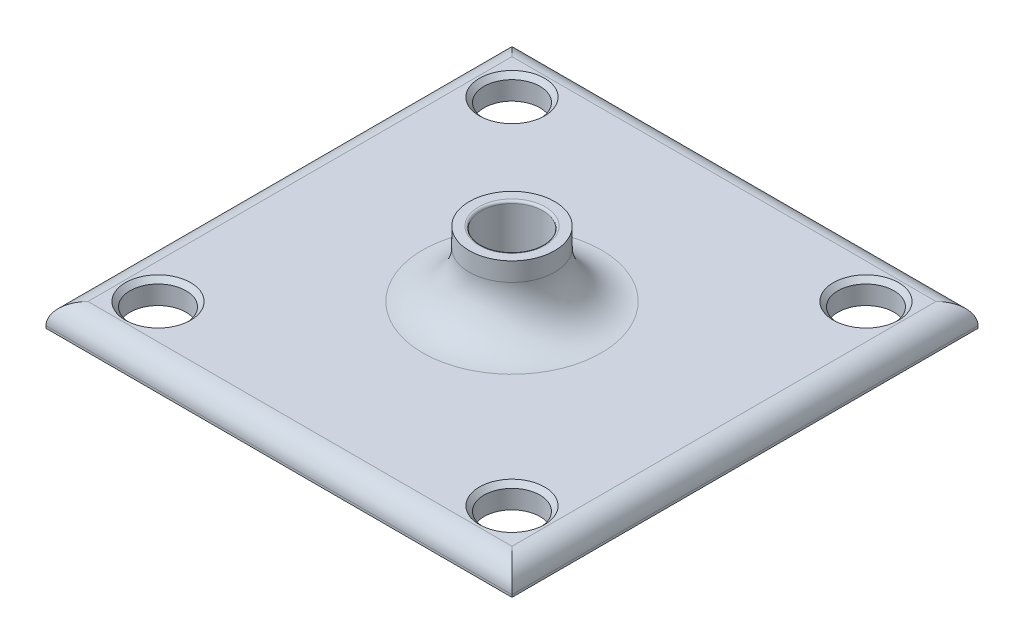
ISO-10303-21;
HEADER;
FILE_DESCRIPTION(('STEP AP214'),'2;1');
FILE_NAME('part.step','',(''),(''),'','','');
FILE_SCHEMA(('AUTOMOTIVE_DESIGN { 1 0 10303 214 1 1 1 1 }'));
ENDSEC;
DATA;
#1=APPLICATION_CONTEXT('core data for automotive mechanical design processes');
#2=APPLICATION_PROTOCOL_DEFINITION('international standard','automotive_design',2000,#1);
#3=PRODUCT_CONTEXT('',#1,'mechanical');
#4=PRODUCT('Part','Part','',(#3));
#5=PRODUCT_RELATED_PRODUCT_CATEGORY('part','',(#4));
#6=PRODUCT_DEFINITION_FORMATION('','',#4);
#7=PRODUCT_DEFINITION_CONTEXT('part definition',#1,'design');
#8=PRODUCT_DEFINITION('design','',#6,#7);
#9=PRODUCT_DEFINITION_SHAPE('','',#8);
#10=(LENGTH_UNIT() NAMED_UNIT(*) SI_UNIT(.MILLI.,.METRE.));
#11=(NAMED_UNIT(*) PLANE_ANGLE_UNIT() SI_UNIT($,.RADIAN.));
#12=(NAMED_UNIT(*) SI_UNIT($,.STERADIAN.) SOLID_ANGLE_UNIT());
#13=UNCERTAINTY_MEASURE_WITH_UNIT(LENGTH_MEASURE(1.E-05),#10,'distance_accuracy_value','');
#14=(GEOMETRIC_REPRESENTATION_CONTEXT(3) GLOBAL_UNCERTAINTY_ASSIGNED_CONTEXT((#13)) GLOBAL_UNIT_ASSIGNED_CONTEXT((#10,
#11,#12)) REPRESENTATION_CONTEXT('',''));
#15=CARTESIAN_POINT('',(0.,0.,0.));
#16=DIRECTION('',(0.,0.,1.));
#17=DIRECTION('',(1.,0.,0.));
#18=AXIS2_PLACEMENT_3D('',#15,#16,#17);
#19=CARTESIAN_POINT('',(0.,2.5,0.));
#20=DIRECTION('',(0.,-1.,0.));
#21=DIRECTION('',(0.,0.,-1.));
#22=AXIS2_PLACEMENT_3D('',#19,#20,#21);
#23=PLANE('',#22);
#24=CARTESIAN_POINT('',(0.,2.5,0.));
#25=DIRECTION('',(0.,1.,0.));
#26=DIRECTION('',(0.,0.,1.));
#27=AXIS2_PLACEMENT_3D('',#24,#25,#26);
#28=CIRCLE('',#27,1.525);
#29=CARTESIAN_POINT('',(0.,2.5,1.525));
#30=VERTEX_POINT('',#29);
#31=EDGE_CURVE('E114',#30,#30,#28,.T.);
#32=ORIENTED_EDGE('',*,*,#31,.F.);
#33=EDGE_LOOP('',(#32));
#34=FACE_BOUND('',#33,.T.);
#35=CARTESIAN_POINT('',(0.,2.5,0.));
#36=DIRECTION('',(0.,1.,0.));
#37=DIRECTION('',(0.,0.,1.));
#38=AXIS2_PLACEMENT_3D('',#35,#36,#37);
#39=CIRCLE('',#38,3.325);
#40=CARTESIAN_POINT('',(0.,2.5,3.325));
#41=VERTEX_POINT('',#40);
#42=EDGE_CURVE('E169',#41,#41,#39,.T.);
#43=ORIENTED_EDGE('',*,*,#42,.T.);
#44=EDGE_LOOP('',(#43));
#45=FACE_BOUND('',#44,.T.);
#46=ADVANCED_FACE('F33',(#34,#45),#23,.F.);
#47=CARTESIAN_POINT('',(-18.9895923599143,2.5,18.9895923599143));
#48=DIRECTION('',(0.,-1.,0.));
#49=DIRECTION('',(0.,0.,-1.));
#50=AXIS2_PLACEMENT_3D('',#47,#48,#49);
#51=CIRCLE('',#50,3.49999999999999);
#52=CARTESIAN_POINT('',(-18.9895923599143,2.5,15.4895923599144));
#53=VERTEX_POINT('',#52);
#54=EDGE_CURVE('E178',#53,#53,#51,.T.);
#55=ORIENTED_EDGE('',*,*,#54,.T.);
#56=EDGE_LOOP('',(#55));
#57=FACE_BOUND('',#56,.T.);
#58=CARTESIAN_POINT('',(18.9895923599143,2.5,18.9895923599143));
#59=DIRECTION('',(0.,-1.,0.));
#60=DIRECTION('',(0.,0.,-1.));
#61=AXIS2_PLACEMENT_3D('',#58,#59,#60);
#62=CIRCLE('',#61,3.50000000000002);
#63=CARTESIAN_POINT('',(18.9895923599143,2.5,15.4895923599143));
#64=VERTEX_POINT('',#63);
#65=EDGE_CURVE('E175',#64,#64,#62,.T.);
#66=ORIENTED_EDGE('',*,*,#65,.T.);
#67=EDGE_LOOP('',(#66));
#68=FACE_BOUND('',#67,.T.);
#69=CARTESIAN_POINT('',(18.9895923599143,2.5,-18.9895923599143));
#70=DIRECTION('',(0.,-1.,0.));
#71=DIRECTION('',(0.,0.,-1.));
#72=AXIS2_PLACEMENT_3D('',#69,#70,#71);
#73=CIRCLE('',#72,3.49999999999999);
#74=CARTESIAN_POINT('',(18.9895923599143,2.5,-22.4895923599143));
#75=VERTEX_POINT('',#74);
#76=EDGE_CURVE('E172',#75,#75,#73,.T.);
#77=ORIENTED_EDGE('',*,*,#76,.T.);
#78=EDGE_LOOP('',(#77));
#79=FACE_BOUND('',#78,.T.);
#80=CARTESIAN_POINT('',(-18.9895923599143,2.5,-18.9895923599143));
#81=DIRECTION('',(0.,-1.,0.));
#82=DIRECTION('',(0.,0.,-1.));
#83=AXIS2_PLACEMENT_3D('',#80,#81,#82);
#84=CIRCLE('',#83,3.50000000000002);
#85=CARTESIAN_POINT('',(-18.9895923599143,2.5,-22.4895923599144));
#86=VERTEX_POINT('',#85);
#87=EDGE_CURVE('E158',#86,#86,#84,.T.);
#88=ORIENTED_EDGE('',*,*,#87,.T.);
#89=EDGE_LOOP('',(#88));
#90=FACE_BOUND('',#89,.T.);
#91=DIRECTION('',(0.,0.,-1.));
#92=VECTOR('',#91,1.);
#93=CARTESIAN_POINT('',(22.75,2.5,0.));
#94=LINE('',#93,#92);
#95=CARTESIAN_POINT('',(22.75,2.5,22.75));
#96=VERTEX_POINT('',#95);
#97=CARTESIAN_POINT('',(22.75,2.5,-22.75));
#98=VERTEX_POINT('',#97);
#99=EDGE_CURVE('E148',#96,#98,#94,.T.);
#100=ORIENTED_EDGE('',*,*,#99,.T.);
#101=DIRECTION('',(-1.,0.,0.));
#102=VECTOR('',#101,1.);
#103=CARTESIAN_POINT('',(0.,2.5,-22.75));
#104=LINE('',#103,#102);
#105=CARTESIAN_POINT('',(-22.75,2.5,-22.75));
#106=VERTEX_POINT('',#105);
#107=EDGE_CURVE('E150',#98,#106,#104,.T.);
#108=ORIENTED_EDGE('',*,*,#107,.T.);
#109=DIRECTION('',(0.,0.,1.));
#110=VECTOR('',#109,1.);
#111=CARTESIAN_POINT('',(-22.75,2.5,0.));
#112=LINE('',#111,#110);
#113=CARTESIAN_POINT('',(-22.75,2.5,22.75));
#114=VERTEX_POINT('',#113);
#115=EDGE_CURVE('E144',#106,#114,#112,.T.);
#116=ORIENTED_EDGE('',*,*,#115,.T.);
#117=DIRECTION('',(1.,0.,0.));
#118=VECTOR('',#117,1.);
#119=CARTESIAN_POINT('',(0.,2.5,22.75));
#120=LINE('',#119,#118);
#121=EDGE_CURVE('E146',#114,#96,#120,.T.);
#122=ORIENTED_EDGE('',*,*,#121,.T.);
#123=EDGE_LOOP('',(#100,#108,#116,#122));
#124=FACE_BOUND('',#123,.T.);
#125=CARTESIAN_POINT('',(0.,2.5,0.));
#126=DIRECTION('',(0.,-1.,0.));
#127=DIRECTION('',(0.,0.,-1.));
#128=AXIS2_PLACEMENT_3D('',#125,#126,#127);
#129=CIRCLE('',#128,9.575);
#130=CARTESIAN_POINT('',(0.,2.5,-9.575));
#131=VERTEX_POINT('',#130);
#132=EDGE_CURVE('E141',#131,#131,#129,.T.);
#133=ORIENTED_EDGE('',*,*,#132,.T.);
#134=EDGE_LOOP('',(#133));
#135=FACE_BOUND('',#134,.T.);
#136=ADVANCED_FACE('F208',(#57,#68,#79,#90,#124,#135),#23,.F.);
#137=CARTESIAN_POINT('',(0.,0.,0.));
#138=DIRECTION('',(0.,-1.,0.));
#139=DIRECTION('',(0.,0.,-1.));
#140=AXIS2_PLACEMENT_3D('',#137,#138,#139);
#141=PLANE('',#140);
#142=CARTESIAN_POINT('',(18.9895923599143,0.,-18.9895923599143));
#143=DIRECTION('',(0.,-1.,0.));
#144=DIRECTION('',(0.,0.,-1.));
#145=AXIS2_PLACEMENT_3D('',#142,#143,#144);
#146=CIRCLE('',#145,3.);
#147=CARTESIAN_POINT('',(18.9895923599143,0.,-21.9895923599143));
#148=VERTEX_POINT('',#147);
#149=EDGE_CURVE('E129',#148,#148,#146,.F.);
#150=ORIENTED_EDGE('',*,*,#149,.T.);
#151=EDGE_LOOP('',(#150));
#152=FACE_BOUND('',#151,.T.);
#153=CARTESIAN_POINT('',(-18.9895923599143,0.,-18.9895923599143));
#154=DIRECTION('',(0.,-1.,0.));
#155=DIRECTION('',(0.,0.,-1.));
#156=AXIS2_PLACEMENT_3D('',#153,#154,#155);
#157=CIRCLE('',#156,3.);
#158=CARTESIAN_POINT('',(-18.9895923599143,0.,-21.9895923599143));
#159=VERTEX_POINT('',#158);
#160=EDGE_CURVE('E126',#159,#159,#157,.T.);
#161=ORIENTED_EDGE('',*,*,#160,.F.);
#162=EDGE_LOOP('',(#161));
#163=FACE_BOUND('',#162,.T.);
#164=CARTESIAN_POINT('',(0.,0.,0.));
#165=DIRECTION('',(0.,-1.,0.));
#166=DIRECTION('',(0.,0.,-1.));
#167=AXIS2_PLACEMENT_3D('',#164,#165,#166);
#168=CIRCLE('',#167,1.525);
#169=CARTESIAN_POINT('',(0.,0.,-1.525));
#170=VERTEX_POINT('',#169);
#171=EDGE_CURVE('E111',#170,#170,#168,.T.);
#172=ORIENTED_EDGE('',*,*,#171,.F.);
#173=EDGE_LOOP('',(#172));
#174=FACE_BOUND('',#173,.T.);
#175=DIRECTION('',(0.,0.,-1.));
#176=VECTOR('',#175,1.);
#177=CARTESIAN_POINT('',(25.,0.,25.));
#178=LINE('',#177,#176);
#179=CARTESIAN_POINT('',(25.,0.,25.));
#180=VERTEX_POINT('',#179);
#181=CARTESIAN_POINT('',(25.,0.,-25.));
#182=VERTEX_POINT('',#181);
#183=EDGE_CURVE('E104',#180,#182,#178,.T.);
#184=ORIENTED_EDGE('',*,*,#183,.F.);
#185=DIRECTION('',(1.,0.,0.));
#186=VECTOR('',#185,1.);
#187=CARTESIAN_POINT('',(-25.,0.,25.));
#188=LINE('',#187,#186);
#189=CARTESIAN_POINT('',(-25.,0.,25.));
#190=VERTEX_POINT('',#189);
#191=EDGE_CURVE('E120',#190,#180,#188,.T.);
#192=ORIENTED_EDGE('',*,*,#191,.F.);
#193=DIRECTION('',(0.,0.,1.));
#194=VECTOR('',#193,1.);
#195=CARTESIAN_POINT('',(-25.,0.,25.));
#196=LINE('',#195,#194);
#197=CARTESIAN_POINT('',(-25.,0.,-25.));
#198=VERTEX_POINT('',#197);
#199=EDGE_CURVE('E106',#198,#190,#196,.T.);
#200=ORIENTED_EDGE('',*,*,#199,.F.);
#201=DIRECTION('',(-1.,0.,0.));
#202=VECTOR('',#201,1.);
#203=CARTESIAN_POINT('',(-25.,0.,-25.));
#204=LINE('',#203,#202);
#205=EDGE_CURVE('E91',#182,#198,#204,.T.);
#206=ORIENTED_EDGE('',*,*,#205,.F.);
#207=EDGE_LOOP('',(#184,#192,#200,#206));
#208=FACE_BOUND('',#207,.T.);
#209=CARTESIAN_POINT('',(18.9895923599143,0.,18.9895923599143));
#210=DIRECTION('',(0.,-1.,0.));
#211=DIRECTION('',(0.,0.,-1.));
#212=AXIS2_PLACEMENT_3D('',#209,#210,#211);
#213=CIRCLE('',#212,3.);
#214=CARTESIAN_POINT('',(18.9895923599143,0.,15.9895923599144));
#215=VERTEX_POINT('',#214);
#216=EDGE_CURVE('E133',#215,#215,#213,.T.);
#217=ORIENTED_EDGE('',*,*,#216,.F.);
#218=EDGE_LOOP('',(#217));
#219=FACE_BOUND('',#218,.T.);
#220=CARTESIAN_POINT('',(-18.9895923599143,0.,18.9895923599143));
#221=DIRECTION('',(0.,-1.,0.));
#222=DIRECTION('',(0.,0.,-1.));
#223=AXIS2_PLACEMENT_3D('',#220,#221,#222);
#224=CIRCLE('',#223,3.);
#225=CARTESIAN_POINT('',(-18.9895923599143,0.,15.9895923599144));
#226=VERTEX_POINT('',#225);
#227=EDGE_CURVE('E136',#226,#226,#224,.F.);
#228=ORIENTED_EDGE('',*,*,#227,.T.);
#229=EDGE_LOOP('',(#228));
#230=FACE_BOUND('',#229,.T.);
#231=ADVANCED_FACE('F101',(#152,#163,#174,#208,#219,#230),#141,.T.);
#232=CARTESIAN_POINT('',(25.,2.5,25.));
#233=DIRECTION('',(-1.,0.,0.));
#234=DIRECTION('',(0.,0.,1.));
#235=AXIS2_PLACEMENT_3D('',#232,#233,#234);
#236=PLANE('',#235);
#237=DIRECTION('',(0.,-1.,0.));
#238=VECTOR('',#237,1.);
#239=CARTESIAN_POINT('',(25.,2.5,-25.));
#240=LINE('',#239,#238);
#241=CARTESIAN_POINT('',(25.,0.25,-25.));
#242=VERTEX_POINT('',#241);
#243=EDGE_CURVE('E87',#242,#182,#240,.T.);
#244=ORIENTED_EDGE('',*,*,#243,.F.);
#245=DIRECTION('',(0.,0.,-1.));
#246=VECTOR('',#245,1.);
#247=CARTESIAN_POINT('',(25.,0.25,25.));
#248=LINE('',#247,#246);
#249=CARTESIAN_POINT('',(25.,0.25,25.));
#250=VERTEX_POINT('',#249);
#251=EDGE_CURVE('E56',#242,#250,#248,.F.);
#252=ORIENTED_EDGE('',*,*,#251,.T.);
#253=DIRECTION('',(0.,-1.,0.));
#254=VECTOR('',#253,1.);
#255=CARTESIAN_POINT('',(25.,2.5,25.));
#256=LINE('',#255,#254);
#257=EDGE_CURVE('E109',#250,#180,#256,.T.);
#258=ORIENTED_EDGE('',*,*,#257,.T.);
#259=ORIENTED_EDGE('',*,*,#183,.T.);
#260=EDGE_LOOP('',(#244,#252,#258,#259));
#261=FACE_BOUND('',#260,.T.);
#262=ADVANCED_FACE('F108',(#261),#236,.F.);
#263=CARTESIAN_POINT('',(-25.,2.5,-25.));
#264=DIRECTION('',(0.,0.,1.));
#265=DIRECTION('',(1.,0.,0.));
#266=AXIS2_PLACEMENT_3D('',#263,#264,#265);
#267=PLANE('',#266);
#268=DIRECTION('',(0.,-1.,0.));
#269=VECTOR('',#268,1.);
#270=CARTESIAN_POINT('',(-25.,2.5,-25.));
#271=LINE('',#270,#269);
#272=CARTESIAN_POINT('',(-25.,0.25,-25.));
#273=VERTEX_POINT('',#272);
#274=EDGE_CURVE('E97',#273,#198,#271,.T.);
#275=ORIENTED_EDGE('',*,*,#274,.F.);
#276=DIRECTION('',(-1.,0.,0.));
#277=VECTOR('',#276,1.);
#278=CARTESIAN_POINT('',(-25.,0.25,-25.));
#279=LINE('',#278,#277);
#280=EDGE_CURVE('E94',#273,#242,#279,.F.);
#281=ORIENTED_EDGE('',*,*,#280,.T.);
#282=ORIENTED_EDGE('',*,*,#243,.T.);
#283=ORIENTED_EDGE('',*,*,#205,.T.);
#284=EDGE_LOOP('',(#275,#281,#282,#283));
#285=FACE_BOUND('',#284,.T.);
#286=ADVANCED_FACE('F90',(#285),#267,.F.);
#287=CARTESIAN_POINT('',(-25.,2.5,25.));
#288=DIRECTION('',(1.,0.,0.));
#289=DIRECTION('',(0.,0.,-1.));
#290=AXIS2_PLACEMENT_3D('',#287,#288,#289);
#291=PLANE('',#290);
#292=DIRECTION('',(0.,-1.,0.));
#293=VECTOR('',#292,1.);
#294=CARTESIAN_POINT('',(-25.,2.5,25.));
#295=LINE('',#294,#293);
#296=CARTESIAN_POINT('',(-25.,0.25,25.));
#297=VERTEX_POINT('',#296);
#298=EDGE_CURVE('E123',#297,#190,#295,.T.);
#299=ORIENTED_EDGE('',*,*,#298,.F.);
#300=DIRECTION('',(0.,0.,1.));
#301=VECTOR('',#300,1.);
#302=CARTESIAN_POINT('',(-25.,0.25,25.));
#303=LINE('',#302,#301);
#304=EDGE_CURVE('E156',#297,#273,#303,.F.);
#305=ORIENTED_EDGE('',*,*,#304,.T.);
#306=ORIENTED_EDGE('',*,*,#274,.T.);
#307=ORIENTED_EDGE('',*,*,#199,.T.);
#308=EDGE_LOOP('',(#299,#305,#306,#307));
#309=FACE_BOUND('',#308,.T.);
#310=ADVANCED_FACE('F227',(#309),#291,.F.);
#311=CARTESIAN_POINT('',(-25.,2.5,25.));
#312=DIRECTION('',(0.,0.,-1.));
#313=DIRECTION('',(-1.,0.,0.));
#314=AXIS2_PLACEMENT_3D('',#311,#312,#313);
#315=PLANE('',#314);
#316=ORIENTED_EDGE('',*,*,#257,.F.);
#317=DIRECTION('',(1.,0.,0.));
#318=VECTOR('',#317,1.);
#319=CARTESIAN_POINT('',(-25.,0.25,25.));
#320=LINE('',#319,#318);
#321=EDGE_CURVE('E48',#250,#297,#320,.F.);
#322=ORIENTED_EDGE('',*,*,#321,.T.);
#323=ORIENTED_EDGE('',*,*,#298,.T.);
#324=ORIENTED_EDGE('',*,*,#191,.T.);
#325=EDGE_LOOP('',(#316,#322,#323,#324));
#326=FACE_BOUND('',#325,.T.);
#327=ADVANCED_FACE('F224',(#326),#315,.F.);
#328=CARTESIAN_POINT('',(0.,-95.,0.));
#329=DIRECTION('',(0.,1.,0.));
#330=DIRECTION('',(0.,0.,1.));
#331=AXIS2_PLACEMENT_3D('',#328,#329,#330);
#332=CYLINDRICAL_SURFACE('',#331,1.525);
#333=ORIENTED_EDGE('',*,*,#171,.T.);
#334=EDGE_LOOP('',(#333));
#335=FACE_BOUND('',#334,.T.);
#336=ORIENTED_EDGE('',*,*,#31,.T.);
#337=EDGE_LOOP('',(#336));
#338=FACE_BOUND('',#337,.T.);
#339=ADVANCED_FACE('F219',(#335,#338),#332,.F.);
#340=CARTESIAN_POINT('',(-18.9895923599143,-95.,-18.9895923599143));
#341=DIRECTION('',(0.,1.,0.));
#342=DIRECTION('',(0.,0.,1.));
#343=AXIS2_PLACEMENT_3D('',#340,#341,#342);
#344=CYLINDRICAL_SURFACE('',#343,3.);
#345=CARTESIAN_POINT('',(-18.9895923599143,1.99999999999997,-18.9895923599143));
#346=DIRECTION('',(0.,-1.,0.));
#347=DIRECTION('',(0.,0.,-1.));
#348=AXIS2_PLACEMENT_3D('',#345,#346,#347);
#349=CIRCLE('',#348,3.);
#350=CARTESIAN_POINT('',(-18.9895923599143,1.99999999999997,-21.9895923599143));
#351=VERTEX_POINT('',#350);
#352=EDGE_CURVE('E190',#351,#351,#349,.F.);
#353=ORIENTED_EDGE('',*,*,#352,.T.);
#354=EDGE_LOOP('',(#353));
#355=FACE_BOUND('',#354,.T.);
#356=ORIENTED_EDGE('',*,*,#160,.T.);
#357=EDGE_LOOP('',(#356));
#358=FACE_BOUND('',#357,.T.);
#359=ADVANCED_FACE('F305',(#355,#358),#344,.F.);
#360=CARTESIAN_POINT('',(18.9895923599143,-95.,-18.9895923599143));
#361=DIRECTION('',(0.,1.,0.));
#362=DIRECTION('',(0.,0.,1.));
#363=AXIS2_PLACEMENT_3D('',#360,#361,#362);
#364=CYLINDRICAL_SURFACE('',#363,3.);
#365=CARTESIAN_POINT('',(18.9895923599143,2.,-18.9895923599143));
#366=DIRECTION('',(0.,-1.,0.));
#367=DIRECTION('',(0.,0.,-1.));
#368=AXIS2_PLACEMENT_3D('',#365,#366,#367);
#369=CIRCLE('',#368,3.);
#370=CARTESIAN_POINT('',(18.9895923599143,2.,-21.9895923599143));
#371=VERTEX_POINT('',#370);
#372=EDGE_CURVE('E187',#371,#371,#369,.F.);
#373=ORIENTED_EDGE('',*,*,#372,.T.);
#374=EDGE_LOOP('',(#373));
#375=FACE_BOUND('',#374,.T.);
#376=ORIENTED_EDGE('',*,*,#149,.F.);
#377=EDGE_LOOP('',(#376));
#378=FACE_BOUND('',#377,.T.);
#379=ADVANCED_FACE('F301',(#375,#378),#364,.F.);
#380=CARTESIAN_POINT('',(18.9895923599143,-95.,18.9895923599143));
#381=DIRECTION('',(0.,1.,0.));
#382=DIRECTION('',(0.,0.,1.));
#383=AXIS2_PLACEMENT_3D('',#380,#381,#382);
#384=CYLINDRICAL_SURFACE('',#383,3.);
#385=CARTESIAN_POINT('',(18.9895923599143,1.99999999999997,18.9895923599143));
#386=DIRECTION('',(0.,-1.,0.));
#387=DIRECTION('',(0.,0.,-1.));
#388=AXIS2_PLACEMENT_3D('',#385,#386,#387);
#389=CIRCLE('',#388,3.);
#390=CARTESIAN_POINT('',(18.9895923599143,1.99999999999997,15.9895923599144));
#391=VERTEX_POINT('',#390);
#392=EDGE_CURVE('E184',#391,#391,#389,.F.);
#393=ORIENTED_EDGE('',*,*,#392,.T.);
#394=EDGE_LOOP('',(#393));
#395=FACE_BOUND('',#394,.T.);
#396=ORIENTED_EDGE('',*,*,#216,.T.);
#397=EDGE_LOOP('',(#396));
#398=FACE_BOUND('',#397,.T.);
#399=ADVANCED_FACE('F304',(#395,#398),#384,.F.);
#400=CARTESIAN_POINT('',(-18.9895923599143,-95.,18.9895923599143));
#401=DIRECTION('',(0.,1.,0.));
#402=DIRECTION('',(0.,0.,1.));
#403=AXIS2_PLACEMENT_3D('',#400,#401,#402);
#404=CYLINDRICAL_SURFACE('',#403,3.);
#405=CARTESIAN_POINT('',(-18.9895923599143,2.,18.9895923599143));
#406=DIRECTION('',(0.,-1.,0.));
#407=DIRECTION('',(0.,0.,-1.));
#408=AXIS2_PLACEMENT_3D('',#405,#406,#407);
#409=CIRCLE('',#408,3.);
#410=CARTESIAN_POINT('',(-18.9895923599143,2.,15.9895923599144));
#411=VERTEX_POINT('',#410);
#412=EDGE_CURVE('E181',#411,#411,#409,.F.);
#413=ORIENTED_EDGE('',*,*,#412,.T.);
#414=EDGE_LOOP('',(#413));
#415=FACE_BOUND('',#414,.T.);
#416=ORIENTED_EDGE('',*,*,#227,.F.);
#417=EDGE_LOOP('',(#416));
#418=FACE_BOUND('',#417,.T.);
#419=ADVANCED_FACE('F298',(#415,#418),#404,.F.);
#420=CARTESIAN_POINT('',(0.,9.5,0.));
#421=DIRECTION('',(0.,1.,0.));
#422=DIRECTION('',(0.,0.,1.));
#423=AXIS2_PLACEMENT_3D('',#420,#421,#422);
#424=PLANE('',#423);
#425=CARTESIAN_POINT('',(0.,9.5,0.));
#426=DIRECTION('',(0.,1.,0.));
#427=DIRECTION('',(0.,0.,1.));
#428=AXIS2_PLACEMENT_3D('',#425,#426,#427);
#429=CIRCLE('',#428,3.575);
#430=CARTESIAN_POINT('',(0.,9.5,3.575));
#431=VERTEX_POINT('',#430);
#432=EDGE_CURVE('E11',#431,#431,#429,.F.);
#433=ORIENTED_EDGE('',*,*,#432,.T.);
#434=EDGE_LOOP('',(#433));
#435=FACE_BOUND('',#434,.T.);
#436=CARTESIAN_POINT('',(0.,9.5,0.));
#437=DIRECTION('',(0.,1.,0.));
#438=DIRECTION('',(0.,0.,1.));
#439=AXIS2_PLACEMENT_3D('',#436,#437,#438);
#440=CIRCLE('',#439,4.575);
#441=CARTESIAN_POINT('',(0.,9.5,4.575));
#442=VERTEX_POINT('',#441);
#443=EDGE_CURVE('E130',#442,#442,#440,.T.);
#444=ORIENTED_EDGE('',*,*,#443,.T.);
#445=EDGE_LOOP('',(#444));
#446=FACE_BOUND('',#445,.T.);
#447=ADVANCED_FACE('F284',(#435,#446),#424,.T.);
#448=CARTESIAN_POINT('',(0.,9.5,0.));
#449=DIRECTION('',(0.,-1.,0.));
#450=DIRECTION('',(0.,0.,-1.));
#451=AXIS2_PLACEMENT_3D('',#448,#449,#450);
#452=CYLINDRICAL_SURFACE('',#451,4.575);
#453=CARTESIAN_POINT('',(0.,7.5,0.));
#454=DIRECTION('',(0.,-1.,0.));
#455=DIRECTION('',(0.,0.,-1.));
#456=AXIS2_PLACEMENT_3D('',#453,#454,#455);
#457=CIRCLE('',#456,4.575);
#458=CARTESIAN_POINT('',(0.,7.5,-4.575));
#459=VERTEX_POINT('',#458);
#460=EDGE_CURVE('E96',#459,#459,#457,.F.);
#461=ORIENTED_EDGE('',*,*,#460,.T.);
#462=EDGE_LOOP('',(#461));
#463=FACE_BOUND('',#462,.T.);
#464=ORIENTED_EDGE('',*,*,#443,.F.);
#465=EDGE_LOOP('',(#464));
#466=FACE_BOUND('',#465,.T.);
#467=ADVANCED_FACE('F281',(#463,#466),#452,.T.);
#468=CARTESIAN_POINT('',(0.,9.5,0.));
#469=DIRECTION('',(0.,-1.,0.));
#470=DIRECTION('',(0.,0.,-1.));
#471=AXIS2_PLACEMENT_3D('',#468,#469,#470);
#472=CYLINDRICAL_SURFACE('',#471,3.325);
#473=CARTESIAN_POINT('',(0.,9.25,0.));
#474=DIRECTION('',(0.,1.,0.));
#475=DIRECTION('',(0.,0.,1.));
#476=AXIS2_PLACEMENT_3D('',#473,#474,#475);
#477=CIRCLE('',#476,3.325);
#478=CARTESIAN_POINT('',(0.,9.25,3.325));
#479=VERTEX_POINT('',#478);
#480=EDGE_CURVE('E41',#479,#479,#477,.T.);
#481=ORIENTED_EDGE('',*,*,#480,.T.);
#482=EDGE_LOOP('',(#481));
#483=FACE_BOUND('',#482,.T.);
#484=ORIENTED_EDGE('',*,*,#42,.F.);
#485=EDGE_LOOP('',(#484));
#486=FACE_BOUND('',#485,.T.);
#487=ADVANCED_FACE('F195',(#483,#486),#472,.F.);
#488=CARTESIAN_POINT('',(0.,7.5,0.));
#489=DIRECTION('',(0.,-1.,0.));
#490=DIRECTION('',(0.,0.,-1.));
#491=AXIS2_PLACEMENT_3D('',#488,#489,#490);
#492=TOROIDAL_SURFACE('',#491,9.575,5.);
#493=ORIENTED_EDGE('',*,*,#132,.F.);
#494=EDGE_LOOP('',(#493));
#495=FACE_BOUND('',#494,.T.);
#496=ORIENTED_EDGE('',*,*,#460,.F.);
#497=EDGE_LOOP('',(#496));
#498=FACE_BOUND('',#497,.T.);
#499=ADVANCED_FACE('F235',(#495,#498),#492,.F.);
#500=CARTESIAN_POINT('',(0.,0.25,22.75));
#501=DIRECTION('',(1.,0.,0.));
#502=DIRECTION('',(0.,0.,-1.));
#503=AXIS2_PLACEMENT_3D('',#500,#501,#502);
#504=CYLINDRICAL_SURFACE('',#503,2.25);
#505=CARTESIAN_POINT('',(-22.75,0.25,22.75));
#506=DIRECTION('',(0.707106781186547,0.,0.707106781186547));
#507=DIRECTION('',(-0.707106781186547,0.,0.707106781186547));
#508=AXIS2_PLACEMENT_3D('',#505,#506,#507);
#509=ELLIPSE('',#508,3.18198051533946,2.25);
#510=EDGE_CURVE('E163',#297,#114,#509,.F.);
#511=ORIENTED_EDGE('',*,*,#510,.F.);
#512=ORIENTED_EDGE('',*,*,#321,.F.);
#513=CARTESIAN_POINT('',(22.75,0.25,22.75));
#514=DIRECTION('',(0.707106781186547,0.,-0.707106781186547));
#515=DIRECTION('',(0.707106781186547,0.,0.707106781186547));
#516=AXIS2_PLACEMENT_3D('',#513,#514,#515);
#517=ELLIPSE('',#516,3.18198051533946,2.25);
#518=EDGE_CURVE('E166',#96,#250,#517,.T.);
#519=ORIENTED_EDGE('',*,*,#518,.F.);
#520=ORIENTED_EDGE('',*,*,#121,.F.);
#521=EDGE_LOOP('',(#511,#512,#519,#520));
#522=FACE_BOUND('',#521,.T.);
#523=ADVANCED_FACE('F238',(#522),#504,.T.);
#524=CARTESIAN_POINT('',(22.75,0.25,0.));
#525=DIRECTION('',(0.,0.,-1.));
#526=DIRECTION('',(-1.,0.,0.));
#527=AXIS2_PLACEMENT_3D('',#524,#525,#526);
#528=CYLINDRICAL_SURFACE('',#527,2.25);
#529=ORIENTED_EDGE('',*,*,#518,.T.);
#530=ORIENTED_EDGE('',*,*,#251,.F.);
#531=CARTESIAN_POINT('',(22.75,0.25,-22.75));
#532=DIRECTION('',(-0.707106781186547,0.,-0.707106781186547));
#533=DIRECTION('',(0.707106781186547,0.,-0.707106781186547));
#534=AXIS2_PLACEMENT_3D('',#531,#532,#533);
#535=ELLIPSE('',#534,3.18198051533946,2.25);
#536=EDGE_CURVE('E161',#98,#242,#535,.T.);
#537=ORIENTED_EDGE('',*,*,#536,.F.);
#538=ORIENTED_EDGE('',*,*,#99,.F.);
#539=EDGE_LOOP('',(#529,#530,#537,#538));
#540=FACE_BOUND('',#539,.T.);
#541=ADVANCED_FACE('F248',(#540),#528,.T.);
#542=CARTESIAN_POINT('',(-22.75,0.25,0.));
#543=DIRECTION('',(0.,0.,1.));
#544=DIRECTION('',(1.,0.,0.));
#545=AXIS2_PLACEMENT_3D('',#542,#543,#544);
#546=CYLINDRICAL_SURFACE('',#545,2.25);
#547=ORIENTED_EDGE('',*,*,#510,.T.);
#548=ORIENTED_EDGE('',*,*,#115,.F.);
#549=CARTESIAN_POINT('',(-22.75,0.25,-22.75));
#550=DIRECTION('',(-0.707106781186547,0.,0.707106781186547));
#551=DIRECTION('',(0.707106781186547,0.,0.707106781186547));
#552=AXIS2_PLACEMENT_3D('',#549,#550,#551);
#553=ELLIPSE('',#552,3.18198051533946,2.25);
#554=EDGE_CURVE('E159',#273,#106,#553,.F.);
#555=ORIENTED_EDGE('',*,*,#554,.F.);
#556=ORIENTED_EDGE('',*,*,#304,.F.);
#557=EDGE_LOOP('',(#547,#548,#555,#556));
#558=FACE_BOUND('',#557,.T.);
#559=ADVANCED_FACE('F244',(#558),#546,.T.);
#560=CARTESIAN_POINT('',(0.,0.25,-22.75));
#561=DIRECTION('',(-1.,0.,0.));
#562=DIRECTION('',(0.,0.,1.));
#563=AXIS2_PLACEMENT_3D('',#560,#561,#562);
#564=CYLINDRICAL_SURFACE('',#563,2.25);
#565=ORIENTED_EDGE('',*,*,#536,.T.);
#566=ORIENTED_EDGE('',*,*,#280,.F.);
#567=ORIENTED_EDGE('',*,*,#554,.T.);
#568=ORIENTED_EDGE('',*,*,#107,.F.);
#569=EDGE_LOOP('',(#565,#566,#567,#568));
#570=FACE_BOUND('',#569,.T.);
#571=ADVANCED_FACE('F240',(#570),#564,.T.);
#572=CARTESIAN_POINT('',(-18.9895923599143,2.5,18.9895923599143));
#573=DIRECTION('',(0.,1.,0.));
#574=DIRECTION('',(0.,0.,1.));
#575=AXIS2_PLACEMENT_3D('',#572,#573,#574);
#576=CONICAL_SURFACE('',#575,3.49999999999999,0.785398163397441);
#577=ORIENTED_EDGE('',*,*,#412,.F.);
#578=EDGE_LOOP('',(#577));
#579=FACE_BOUND('',#578,.T.);
#580=ORIENTED_EDGE('',*,*,#54,.F.);
#581=EDGE_LOOP('',(#580));
#582=FACE_BOUND('',#581,.T.);
#583=ADVANCED_FACE('F243',(#579,#582),#576,.F.);
#584=CARTESIAN_POINT('',(18.9895923599143,1.99999999999997,18.9895923599143));
#585=DIRECTION('',(0.,1.,0.));
#586=DIRECTION('',(0.,0.,1.));
#587=AXIS2_PLACEMENT_3D('',#584,#585,#586);
#588=CONICAL_SURFACE('',#587,3.,0.785398163397448);
#589=ORIENTED_EDGE('',*,*,#65,.F.);
#590=EDGE_LOOP('',(#589));
#591=FACE_BOUND('',#590,.T.);
#592=ORIENTED_EDGE('',*,*,#392,.F.);
#593=EDGE_LOOP('',(#592));
#594=FACE_BOUND('',#593,.T.);
#595=ADVANCED_FACE('F258',(#591,#594),#588,.F.);
#596=CARTESIAN_POINT('',(18.9895923599143,2.5,-18.9895923599143));
#597=DIRECTION('',(0.,1.,0.));
#598=DIRECTION('',(0.,0.,1.));
#599=AXIS2_PLACEMENT_3D('',#596,#597,#598);
#600=CONICAL_SURFACE('',#599,3.49999999999999,0.78539816339744);
#601=ORIENTED_EDGE('',*,*,#372,.F.);
#602=EDGE_LOOP('',(#601));
#603=FACE_BOUND('',#602,.T.);
#604=ORIENTED_EDGE('',*,*,#76,.F.);
#605=EDGE_LOOP('',(#604));
#606=FACE_BOUND('',#605,.T.);
#607=ADVANCED_FACE('F204',(#603,#606),#600,.F.);
#608=CARTESIAN_POINT('',(-18.9895923599143,1.99999999999997,-18.9895923599143));
#609=DIRECTION('',(0.,1.,0.));
#610=DIRECTION('',(0.,0.,1.));
#611=AXIS2_PLACEMENT_3D('',#608,#609,#610);
#612=CONICAL_SURFACE('',#611,3.,0.785398163397447);
#613=ORIENTED_EDGE('',*,*,#87,.F.);
#614=EDGE_LOOP('',(#613));
#615=FACE_BOUND('',#614,.T.);
#616=ORIENTED_EDGE('',*,*,#352,.F.);
#617=EDGE_LOOP('',(#616));
#618=FACE_BOUND('',#617,.T.);
#619=ADVANCED_FACE('F199',(#615,#618),#612,.F.);
#620=CARTESIAN_POINT('',(0.,9.25,0.));
#621=DIRECTION('',(0.,1.,0.));
#622=DIRECTION('',(0.,0.,1.));
#623=AXIS2_PLACEMENT_3D('',#620,#621,#622);
#624=TOROIDAL_SURFACE('',#623,3.575,0.25);
#625=ORIENTED_EDGE('',*,*,#432,.F.);
#626=EDGE_LOOP('',(#625));
#627=FACE_BOUND('',#626,.T.);
#628=ORIENTED_EDGE('',*,*,#480,.F.);
#629=EDGE_LOOP('',(#628));
#630=FACE_BOUND('',#629,.T.);
#631=ADVANCED_FACE('F35',(#627,#630),#624,.T.);
#632=CLOSED_SHELL('',(#46,#136,#231,#262,#286,#310,#327,#339,#359,#379,#399,#419,#447,#467,#487,
#499,#523,#541,#559,#571,#583,#595,#607,#619,#631));
#633=MANIFOLD_SOLID_BREP('B2',#632);
#634=ADVANCED_BREP_SHAPE_REPRESENTATION('',(#18,#633),#14);
#635=SHAPE_DEFINITION_REPRESENTATION(#9,#634);
ENDSEC;
END-ISO-10303-21;
